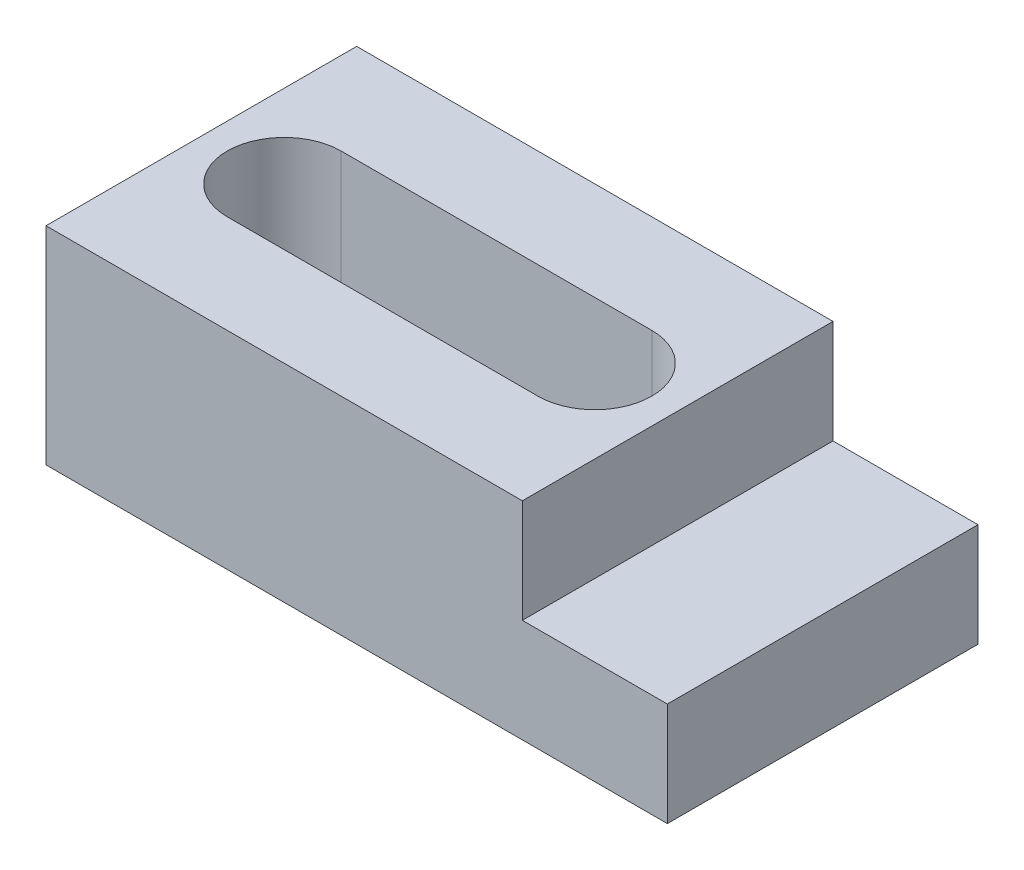
ISO-10303-21;
HEADER;
FILE_DESCRIPTION(('STEP AP214'),'2;1');
FILE_NAME('part.step','',(''),(''),'','','');
FILE_SCHEMA(('AUTOMOTIVE_DESIGN { 1 0 10303 214 1 1 1 1 }'));
ENDSEC;
DATA;
#1=APPLICATION_CONTEXT('core data for automotive mechanical design processes');
#2=APPLICATION_PROTOCOL_DEFINITION('international standard','automotive_design',2000,#1);
#3=PRODUCT_CONTEXT('',#1,'mechanical');
#4=PRODUCT('Part','Part','',(#3));
#5=PRODUCT_RELATED_PRODUCT_CATEGORY('part','',(#4));
#6=PRODUCT_DEFINITION_FORMATION('','',#4);
#7=PRODUCT_DEFINITION_CONTEXT('part definition',#1,'design');
#8=PRODUCT_DEFINITION('design','',#6,#7);
#9=PRODUCT_DEFINITION_SHAPE('','',#8);
#10=(LENGTH_UNIT() NAMED_UNIT(*) SI_UNIT(.MILLI.,.METRE.));
#11=(NAMED_UNIT(*) PLANE_ANGLE_UNIT() SI_UNIT($,.RADIAN.));
#12=(NAMED_UNIT(*) SI_UNIT($,.STERADIAN.) SOLID_ANGLE_UNIT());
#13=UNCERTAINTY_MEASURE_WITH_UNIT(LENGTH_MEASURE(1.E-05),#10,'distance_accuracy_value','');
#14=(GEOMETRIC_REPRESENTATION_CONTEXT(3) GLOBAL_UNCERTAINTY_ASSIGNED_CONTEXT((#13)) GLOBAL_UNIT_ASSIGNED_CONTEXT((#10,
#11,#12)) REPRESENTATION_CONTEXT('',''));
#15=CARTESIAN_POINT('',(0.,0.,0.));
#16=DIRECTION('',(0.,0.,1.));
#17=DIRECTION('',(1.,0.,0.));
#18=AXIS2_PLACEMENT_3D('',#15,#16,#17);
#19=CARTESIAN_POINT('',(0.,10.,0.));
#20=DIRECTION('',(0.,-1.,0.));
#21=DIRECTION('',(0.,0.,-1.));
#22=AXIS2_PLACEMENT_3D('',#19,#20,#21);
#23=PLANE('',#22);
#24=DIRECTION('',(1.,0.,0.));
#25=VECTOR('',#24,1.);
#26=CARTESIAN_POINT('',(-15.,10.,7.5));
#27=LINE('',#26,#25);
#28=CARTESIAN_POINT('',(-15.,10.,7.5));
#29=VERTEX_POINT('',#28);
#30=CARTESIAN_POINT('',(8.,10.,7.5));
#31=VERTEX_POINT('',#30);
#32=EDGE_CURVE('E124',#29,#31,#27,.T.);
#33=ORIENTED_EDGE('',*,*,#32,.T.);
#34=DIRECTION('',(0.,0.,1.));
#35=VECTOR('',#34,1.);
#36=CARTESIAN_POINT('',(8.,10.,-7.5));
#37=LINE('',#36,#35);
#38=CARTESIAN_POINT('',(8.,10.,-7.5));
#39=VERTEX_POINT('',#38);
#40=EDGE_CURVE('E48',#39,#31,#37,.T.);
#41=ORIENTED_EDGE('',*,*,#40,.F.);
#42=DIRECTION('',(-1.,0.,0.));
#43=VECTOR('',#42,1.);
#44=CARTESIAN_POINT('',(-15.,10.,-7.5));
#45=LINE('',#44,#43);
#46=CARTESIAN_POINT('',(-15.,10.,-7.5));
#47=VERTEX_POINT('',#46);
#48=EDGE_CURVE('E121',#39,#47,#45,.T.);
#49=ORIENTED_EDGE('',*,*,#48,.T.);
#50=DIRECTION('',(0.,0.,1.));
#51=VECTOR('',#50,1.);
#52=CARTESIAN_POINT('',(-15.,10.,7.5));
#53=LINE('',#52,#51);
#54=EDGE_CURVE('E130',#47,#29,#53,.T.);
#55=ORIENTED_EDGE('',*,*,#54,.T.);
#56=EDGE_LOOP('',(#33,#41,#49,#55));
#57=FACE_BOUND('',#56,.T.);
#58=CARTESIAN_POINT('',(-11.,10.,0.));
#59=DIRECTION('',(0.,1.,0.));
#60=DIRECTION('',(0.,0.,1.));
#61=AXIS2_PLACEMENT_3D('',#58,#59,#60);
#62=CIRCLE('',#61,2.75);
#63=CARTESIAN_POINT('',(-11.,10.,-2.75));
#64=VERTEX_POINT('',#63);
#65=CARTESIAN_POINT('',(-11.,10.,2.75));
#66=VERTEX_POINT('',#65);
#67=EDGE_CURVE('E167',#64,#66,#62,.T.);
#68=ORIENTED_EDGE('',*,*,#67,.F.);
#69=DIRECTION('',(-1.,0.,0.));
#70=VECTOR('',#69,1.);
#71=CARTESIAN_POINT('',(-11.,10.,-2.75));
#72=LINE('',#71,#70);
#73=CARTESIAN_POINT('',(4.,10.,-2.75));
#74=VERTEX_POINT('',#73);
#75=EDGE_CURVE('E174',#74,#64,#72,.T.);
#76=ORIENTED_EDGE('',*,*,#75,.F.);
#77=CARTESIAN_POINT('',(4.,10.,0.));
#78=DIRECTION('',(0.,1.,0.));
#79=DIRECTION('',(0.,0.,1.));
#80=AXIS2_PLACEMENT_3D('',#77,#78,#79);
#81=CIRCLE('',#80,2.75);
#82=CARTESIAN_POINT('',(4.,10.,2.75));
#83=VERTEX_POINT('',#82);
#84=EDGE_CURVE('E172',#83,#74,#81,.T.);
#85=ORIENTED_EDGE('',*,*,#84,.F.);
#86=DIRECTION('',(1.,0.,0.));
#87=VECTOR('',#86,1.);
#88=CARTESIAN_POINT('',(-11.,10.,2.75));
#89=LINE('',#88,#87);
#90=EDGE_CURVE('E169',#66,#83,#89,.T.);
#91=ORIENTED_EDGE('',*,*,#90,.F.);
#92=EDGE_LOOP('',(#68,#76,#85,#91));
#93=FACE_BOUND('',#92,.T.);
#94=ADVANCED_FACE('F33',(#57,#93),#23,.F.);
#95=CARTESIAN_POINT('',(0.,0.,0.));
#96=DIRECTION('',(0.,-1.,0.));
#97=DIRECTION('',(0.,0.,-1.));
#98=AXIS2_PLACEMENT_3D('',#95,#96,#97);
#99=PLANE('',#98);
#100=DIRECTION('',(0.,0.,-1.));
#101=VECTOR('',#100,1.);
#102=CARTESIAN_POINT('',(15.,0.,7.5));
#103=LINE('',#102,#101);
#104=CARTESIAN_POINT('',(15.,0.,7.5));
#105=VERTEX_POINT('',#104);
#106=CARTESIAN_POINT('',(15.,0.,-7.5));
#107=VERTEX_POINT('',#106);
#108=EDGE_CURVE('E143',#105,#107,#103,.T.);
#109=ORIENTED_EDGE('',*,*,#108,.F.);
#110=DIRECTION('',(1.,0.,0.));
#111=VECTOR('',#110,1.);
#112=CARTESIAN_POINT('',(-15.,0.,7.5));
#113=LINE('',#112,#111);
#114=CARTESIAN_POINT('',(-15.,0.,7.5));
#115=VERTEX_POINT('',#114);
#116=EDGE_CURVE('E131',#115,#105,#113,.T.);
#117=ORIENTED_EDGE('',*,*,#116,.F.);
#118=DIRECTION('',(0.,0.,1.));
#119=VECTOR('',#118,1.);
#120=CARTESIAN_POINT('',(-15.,0.,7.5));
#121=LINE('',#120,#119);
#122=CARTESIAN_POINT('',(-15.,0.,-7.5));
#123=VERTEX_POINT('',#122);
#124=EDGE_CURVE('E135',#123,#115,#121,.T.);
#125=ORIENTED_EDGE('',*,*,#124,.F.);
#126=DIRECTION('',(-1.,0.,0.));
#127=VECTOR('',#126,1.);
#128=CARTESIAN_POINT('',(-15.,0.,-7.5));
#129=LINE('',#128,#127);
#130=EDGE_CURVE('E146',#107,#123,#129,.T.);
#131=ORIENTED_EDGE('',*,*,#130,.F.);
#132=EDGE_LOOP('',(#109,#117,#125,#131));
#133=FACE_BOUND('',#132,.T.);
#134=DIRECTION('',(-1.,0.,0.));
#135=VECTOR('',#134,1.);
#136=CARTESIAN_POINT('',(-11.,0.,-2.75));
#137=LINE('',#136,#135);
#138=CARTESIAN_POINT('',(4.,0.,-2.75));
#139=VERTEX_POINT('',#138);
#140=CARTESIAN_POINT('',(-11.,0.,-2.75));
#141=VERTEX_POINT('',#140);
#142=EDGE_CURVE('E170',#139,#141,#137,.T.);
#143=ORIENTED_EDGE('',*,*,#142,.T.);
#144=CARTESIAN_POINT('',(-11.,0.,0.));
#145=DIRECTION('',(0.,1.,0.));
#146=DIRECTION('',(0.,0.,1.));
#147=AXIS2_PLACEMENT_3D('',#144,#145,#146);
#148=CIRCLE('',#147,2.75);
#149=CARTESIAN_POINT('',(-11.,0.,2.75));
#150=VERTEX_POINT('',#149);
#151=EDGE_CURVE('E163',#141,#150,#148,.T.);
#152=ORIENTED_EDGE('',*,*,#151,.T.);
#153=DIRECTION('',(1.,0.,0.));
#154=VECTOR('',#153,1.);
#155=CARTESIAN_POINT('',(-11.,0.,2.75));
#156=LINE('',#155,#154);
#157=CARTESIAN_POINT('',(4.,0.,2.75));
#158=VERTEX_POINT('',#157);
#159=EDGE_CURVE('E179',#150,#158,#156,.T.);
#160=ORIENTED_EDGE('',*,*,#159,.T.);
#161=CARTESIAN_POINT('',(4.,0.,0.));
#162=DIRECTION('',(0.,1.,0.));
#163=DIRECTION('',(0.,0.,1.));
#164=AXIS2_PLACEMENT_3D('',#161,#162,#163);
#165=CIRCLE('',#164,2.75);
#166=EDGE_CURVE('E182',#158,#139,#165,.T.);
#167=ORIENTED_EDGE('',*,*,#166,.T.);
#168=EDGE_LOOP('',(#143,#152,#160,#167));
#169=FACE_BOUND('',#168,.T.);
#170=ADVANCED_FACE('F201',(#133,#169),#99,.T.);
#171=CARTESIAN_POINT('',(15.,10.,7.5));
#172=DIRECTION('',(-1.,0.,0.));
#173=DIRECTION('',(0.,0.,1.));
#174=AXIS2_PLACEMENT_3D('',#171,#172,#173);
#175=PLANE('',#174);
#176=DIRECTION('',(0.,-1.,0.));
#177=VECTOR('',#176,1.);
#178=CARTESIAN_POINT('',(15.,10.,-7.5));
#179=LINE('',#178,#177);
#180=CARTESIAN_POINT('',(15.,5.,-7.5));
#181=VERTEX_POINT('',#180);
#182=EDGE_CURVE('E154',#181,#107,#179,.T.);
#183=ORIENTED_EDGE('',*,*,#182,.F.);
#184=DIRECTION('',(0.,0.,1.));
#185=VECTOR('',#184,1.);
#186=CARTESIAN_POINT('',(15.,5.,-7.5));
#187=LINE('',#186,#185);
#188=CARTESIAN_POINT('',(15.,5.,7.5));
#189=VERTEX_POINT('',#188);
#190=EDGE_CURVE('E161',#181,#189,#187,.T.);
#191=ORIENTED_EDGE('',*,*,#190,.T.);
#192=DIRECTION('',(0.,-1.,0.));
#193=VECTOR('',#192,1.);
#194=CARTESIAN_POINT('',(15.,10.,7.5));
#195=LINE('',#194,#193);
#196=EDGE_CURVE('E142',#189,#105,#195,.T.);
#197=ORIENTED_EDGE('',*,*,#196,.T.);
#198=ORIENTED_EDGE('',*,*,#108,.T.);
#199=EDGE_LOOP('',(#183,#191,#197,#198));
#200=FACE_BOUND('',#199,.T.);
#201=ADVANCED_FACE('F35',(#200),#175,.F.);
#202=CARTESIAN_POINT('',(-15.,10.,-7.5));
#203=DIRECTION('',(0.,0.,1.));
#204=DIRECTION('',(1.,0.,0.));
#205=AXIS2_PLACEMENT_3D('',#202,#203,#204);
#206=PLANE('',#205);
#207=DIRECTION('',(0.,-1.,0.));
#208=VECTOR('',#207,1.);
#209=CARTESIAN_POINT('',(8.,10.,-7.5));
#210=LINE('',#209,#208);
#211=CARTESIAN_POINT('',(8.,5.,-7.5));
#212=VERTEX_POINT('',#211);
#213=EDGE_CURVE('E108',#39,#212,#210,.T.);
#214=ORIENTED_EDGE('',*,*,#213,.T.);
#215=DIRECTION('',(1.,0.,0.));
#216=VECTOR('',#215,1.);
#217=CARTESIAN_POINT('',(15.,5.,-7.5));
#218=LINE('',#217,#216);
#219=EDGE_CURVE('E116',#212,#181,#218,.T.);
#220=ORIENTED_EDGE('',*,*,#219,.T.);
#221=ORIENTED_EDGE('',*,*,#182,.T.);
#222=ORIENTED_EDGE('',*,*,#130,.T.);
#223=DIRECTION('',(0.,-1.,0.));
#224=VECTOR('',#223,1.);
#225=CARTESIAN_POINT('',(-15.,10.,-7.5));
#226=LINE('',#225,#224);
#227=EDGE_CURVE('E128',#47,#123,#226,.T.);
#228=ORIENTED_EDGE('',*,*,#227,.F.);
#229=ORIENTED_EDGE('',*,*,#48,.F.);
#230=EDGE_LOOP('',(#214,#220,#221,#222,#228,#229));
#231=FACE_BOUND('',#230,.T.);
#232=ADVANCED_FACE('F126',(#231),#206,.F.);
#233=CARTESIAN_POINT('',(-15.,10.,7.5));
#234=DIRECTION('',(1.,0.,0.));
#235=DIRECTION('',(0.,0.,-1.));
#236=AXIS2_PLACEMENT_3D('',#233,#234,#235);
#237=PLANE('',#236);
#238=ORIENTED_EDGE('',*,*,#124,.T.);
#239=DIRECTION('',(0.,-1.,0.));
#240=VECTOR('',#239,1.);
#241=CARTESIAN_POINT('',(-15.,10.,7.5));
#242=LINE('',#241,#240);
#243=EDGE_CURVE('E150',#29,#115,#242,.T.);
#244=ORIENTED_EDGE('',*,*,#243,.F.);
#245=ORIENTED_EDGE('',*,*,#54,.F.);
#246=ORIENTED_EDGE('',*,*,#227,.T.);
#247=EDGE_LOOP('',(#238,#244,#245,#246));
#248=FACE_BOUND('',#247,.T.);
#249=ADVANCED_FACE('F227',(#248),#237,.F.);
#250=CARTESIAN_POINT('',(-15.,10.,7.5));
#251=DIRECTION('',(0.,0.,-1.));
#252=DIRECTION('',(-1.,0.,0.));
#253=AXIS2_PLACEMENT_3D('',#250,#251,#252);
#254=PLANE('',#253);
#255=ORIENTED_EDGE('',*,*,#196,.F.);
#256=DIRECTION('',(-1.,0.,0.));
#257=VECTOR('',#256,1.);
#258=CARTESIAN_POINT('',(-15.,5.,7.5));
#259=LINE('',#258,#257);
#260=CARTESIAN_POINT('',(8.,5.,7.5));
#261=VERTEX_POINT('',#260);
#262=EDGE_CURVE('E11',#189,#261,#259,.T.);
#263=ORIENTED_EDGE('',*,*,#262,.T.);
#264=DIRECTION('',(0.,1.,0.));
#265=VECTOR('',#264,1.);
#266=CARTESIAN_POINT('',(8.,10.,7.5));
#267=LINE('',#266,#265);
#268=EDGE_CURVE('E41',#261,#31,#267,.T.);
#269=ORIENTED_EDGE('',*,*,#268,.T.);
#270=ORIENTED_EDGE('',*,*,#32,.F.);
#271=ORIENTED_EDGE('',*,*,#243,.T.);
#272=ORIENTED_EDGE('',*,*,#116,.T.);
#273=EDGE_LOOP('',(#255,#263,#269,#270,#271,#272));
#274=FACE_BOUND('',#273,.T.);
#275=ADVANCED_FACE('F157',(#274),#254,.F.);
#276=CARTESIAN_POINT('',(-11.,10.,0.));
#277=DIRECTION('',(0.,-1.,0.));
#278=DIRECTION('',(0.,0.,-1.));
#279=AXIS2_PLACEMENT_3D('',#276,#277,#278);
#280=CYLINDRICAL_SURFACE('',#279,2.75);
#281=ORIENTED_EDGE('',*,*,#151,.F.);
#282=DIRECTION('',(0.,-1.,0.));
#283=VECTOR('',#282,1.);
#284=CARTESIAN_POINT('',(-11.,10.,-2.75));
#285=LINE('',#284,#283);
#286=EDGE_CURVE('E176',#64,#141,#285,.T.);
#287=ORIENTED_EDGE('',*,*,#286,.F.);
#288=ORIENTED_EDGE('',*,*,#67,.T.);
#289=DIRECTION('',(0.,-1.,0.));
#290=VECTOR('',#289,1.);
#291=CARTESIAN_POINT('',(-11.,10.,2.75));
#292=LINE('',#291,#290);
#293=EDGE_CURVE('E138',#66,#150,#292,.T.);
#294=ORIENTED_EDGE('',*,*,#293,.T.);
#295=EDGE_LOOP('',(#281,#287,#288,#294));
#296=FACE_BOUND('',#295,.T.);
#297=ADVANCED_FACE('F196',(#296),#280,.F.);
#298=CARTESIAN_POINT('',(-11.,10.,2.75));
#299=DIRECTION('',(0.,0.,-1.));
#300=DIRECTION('',(-1.,0.,0.));
#301=AXIS2_PLACEMENT_3D('',#298,#299,#300);
#302=PLANE('',#301);
#303=ORIENTED_EDGE('',*,*,#159,.F.);
#304=ORIENTED_EDGE('',*,*,#293,.F.);
#305=ORIENTED_EDGE('',*,*,#90,.T.);
#306=DIRECTION('',(0.,-1.,0.));
#307=VECTOR('',#306,1.);
#308=CARTESIAN_POINT('',(4.,10.,2.75));
#309=LINE('',#308,#307);
#310=EDGE_CURVE('E189',#83,#158,#309,.T.);
#311=ORIENTED_EDGE('',*,*,#310,.T.);
#312=EDGE_LOOP('',(#303,#304,#305,#311));
#313=FACE_BOUND('',#312,.T.);
#314=ADVANCED_FACE('F205',(#313),#302,.T.);
#315=CARTESIAN_POINT('',(4.,10.,0.));
#316=DIRECTION('',(0.,-1.,0.));
#317=DIRECTION('',(0.,0.,-1.));
#318=AXIS2_PLACEMENT_3D('',#315,#316,#317);
#319=CYLINDRICAL_SURFACE('',#318,2.75);
#320=ORIENTED_EDGE('',*,*,#166,.F.);
#321=ORIENTED_EDGE('',*,*,#310,.F.);
#322=ORIENTED_EDGE('',*,*,#84,.T.);
#323=DIRECTION('',(0.,-1.,0.));
#324=VECTOR('',#323,1.);
#325=CARTESIAN_POINT('',(4.,10.,-2.75));
#326=LINE('',#325,#324);
#327=EDGE_CURVE('E56',#74,#139,#326,.T.);
#328=ORIENTED_EDGE('',*,*,#327,.T.);
#329=EDGE_LOOP('',(#320,#321,#322,#328));
#330=FACE_BOUND('',#329,.T.);
#331=ADVANCED_FACE('F207',(#330),#319,.F.);
#332=CARTESIAN_POINT('',(-11.,10.,-2.75));
#333=DIRECTION('',(0.,0.,1.));
#334=DIRECTION('',(1.,0.,0.));
#335=AXIS2_PLACEMENT_3D('',#332,#333,#334);
#336=PLANE('',#335);
#337=ORIENTED_EDGE('',*,*,#142,.F.);
#338=ORIENTED_EDGE('',*,*,#327,.F.);
#339=ORIENTED_EDGE('',*,*,#75,.T.);
#340=ORIENTED_EDGE('',*,*,#286,.T.);
#341=EDGE_LOOP('',(#337,#338,#339,#340));
#342=FACE_BOUND('',#341,.T.);
#343=ADVANCED_FACE('F202',(#342),#336,.T.);
#344=CARTESIAN_POINT('',(15.,5.,-7.5));
#345=DIRECTION('',(0.,-1.,0.));
#346=DIRECTION('',(1.,0.,0.));
#347=AXIS2_PLACEMENT_3D('',#344,#345,#346);
#348=PLANE('',#347);
#349=ORIENTED_EDGE('',*,*,#190,.F.);
#350=ORIENTED_EDGE('',*,*,#219,.F.);
#351=DIRECTION('',(0.,0.,1.));
#352=VECTOR('',#351,1.);
#353=CARTESIAN_POINT('',(8.,5.,-7.5));
#354=LINE('',#353,#352);
#355=EDGE_CURVE('E111',#212,#261,#354,.T.);
#356=ORIENTED_EDGE('',*,*,#355,.T.);
#357=ORIENTED_EDGE('',*,*,#262,.F.);
#358=EDGE_LOOP('',(#349,#350,#356,#357));
#359=FACE_BOUND('',#358,.T.);
#360=ADVANCED_FACE('F159',(#359),#348,.F.);
#361=CARTESIAN_POINT('',(8.,10.,-7.5));
#362=DIRECTION('',(-1.,0.,0.));
#363=DIRECTION('',(0.,0.,1.));
#364=AXIS2_PLACEMENT_3D('',#361,#362,#363);
#365=PLANE('',#364);
#366=ORIENTED_EDGE('',*,*,#355,.F.);
#367=ORIENTED_EDGE('',*,*,#213,.F.);
#368=ORIENTED_EDGE('',*,*,#40,.T.);
#369=ORIENTED_EDGE('',*,*,#268,.F.);
#370=EDGE_LOOP('',(#366,#367,#368,#369));
#371=FACE_BOUND('',#370,.T.);
#372=ADVANCED_FACE('F109',(#371),#365,.F.);
#373=CLOSED_SHELL('',(#94,#170,#201,#232,#249,#275,#297,#314,#331,#343,#360,#372));
#374=MANIFOLD_SOLID_BREP('B2',#373);
#375=ADVANCED_BREP_SHAPE_REPRESENTATION('',(#18,#374),#14);
#376=SHAPE_DEFINITION_REPRESENTATION(#9,#375);
ENDSEC;
END-ISO-10303-21;
